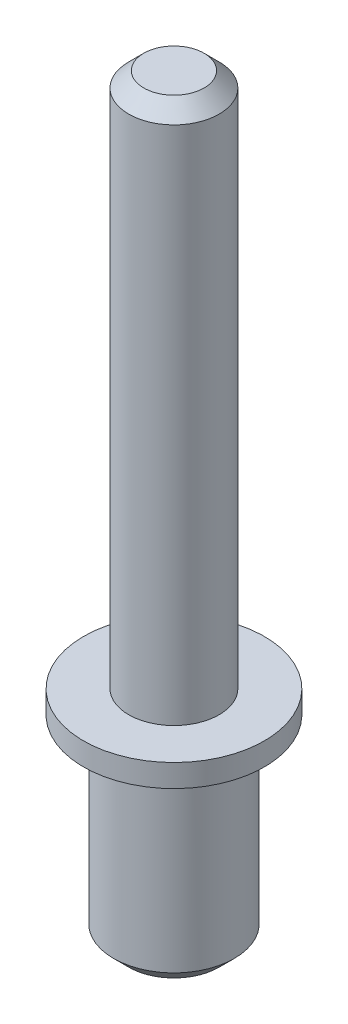
ISO-10303-21;
HEADER;
FILE_DESCRIPTION(('STEP AP214'),'2;1');
FILE_NAME('part.step','',(''),(''),'','','');
FILE_SCHEMA(('AUTOMOTIVE_DESIGN { 1 0 10303 214 1 1 1 1 }'));
ENDSEC;
DATA;
#1=APPLICATION_CONTEXT('core data for automotive mechanical design processes');
#2=APPLICATION_PROTOCOL_DEFINITION('international standard','automotive_design',2000,#1);
#3=PRODUCT_CONTEXT('',#1,'mechanical');
#4=PRODUCT('Part','Part','',(#3));
#5=PRODUCT_RELATED_PRODUCT_CATEGORY('part','',(#4));
#6=PRODUCT_DEFINITION_FORMATION('','',#4);
#7=PRODUCT_DEFINITION_CONTEXT('part definition',#1,'design');
#8=PRODUCT_DEFINITION('design','',#6,#7);
#9=PRODUCT_DEFINITION_SHAPE('','',#8);
#10=(LENGTH_UNIT() NAMED_UNIT(*) SI_UNIT(.MILLI.,.METRE.));
#11=(NAMED_UNIT(*) PLANE_ANGLE_UNIT() SI_UNIT($,.RADIAN.));
#12=(NAMED_UNIT(*) SI_UNIT($,.STERADIAN.) SOLID_ANGLE_UNIT());
#13=UNCERTAINTY_MEASURE_WITH_UNIT(LENGTH_MEASURE(1.E-05),#10,'distance_accuracy_value','');
#14=(GEOMETRIC_REPRESENTATION_CONTEXT(3) GLOBAL_UNCERTAINTY_ASSIGNED_CONTEXT((#13)) GLOBAL_UNIT_ASSIGNED_CONTEXT((#10,
#11,#12)) REPRESENTATION_CONTEXT('',''));
#15=CARTESIAN_POINT('',(0.,0.,0.));
#16=DIRECTION('',(0.,0.,1.));
#17=DIRECTION('',(1.,0.,0.));
#18=AXIS2_PLACEMENT_3D('',#15,#16,#17);
#19=CARTESIAN_POINT('',(0.,0.,0.));
#20=DIRECTION('',(0.,-1.,0.));
#21=DIRECTION('',(1.,0.,0.));
#22=AXIS2_PLACEMENT_3D('',#19,#20,#21);
#23=PLANE('',#22);
#24=CARTESIAN_POINT('',(0.,0.,0.));
#25=DIRECTION('',(0.,-1.,0.));
#26=DIRECTION('',(1.,0.,0.));
#27=AXIS2_PLACEMENT_3D('',#24,#25,#26);
#28=CIRCLE('',#27,2.99999999999998);
#29=CARTESIAN_POINT('',(2.99999999999998,0.,0.));
#30=VERTEX_POINT('',#29);
#31=EDGE_CURVE('E45',#30,#30,#28,.T.);
#32=ORIENTED_EDGE('',*,*,#31,.T.);
#33=EDGE_LOOP('',(#32));
#34=FACE_BOUND('',#33,.T.);
#35=ADVANCED_FACE('F34',(#34),#23,.T.);
#36=CARTESIAN_POINT('',(0.,50.,0.));
#37=DIRECTION('',(0.,1.,0.));
#38=DIRECTION('',(-1.,0.,0.));
#39=AXIS2_PLACEMENT_3D('',#36,#37,#38);
#40=CYLINDRICAL_SURFACE('',#39,3.99999999999999);
#41=CARTESIAN_POINT('',(0.,1.00000000000001,0.));
#42=DIRECTION('',(0.,-1.,0.));
#43=DIRECTION('',(1.,0.,0.));
#44=AXIS2_PLACEMENT_3D('',#41,#42,#43);
#45=CIRCLE('',#44,3.99999999999999);
#46=CARTESIAN_POINT('',(3.99999999999999,1.00000000000001,0.));
#47=VERTEX_POINT('',#46);
#48=EDGE_CURVE('E49',#47,#47,#45,.F.);
#49=ORIENTED_EDGE('',*,*,#48,.T.);
#50=EDGE_LOOP('',(#49));
#51=FACE_BOUND('',#50,.T.);
#52=CARTESIAN_POINT('',(0.,13.,0.));
#53=DIRECTION('',(0.,1.,0.));
#54=DIRECTION('',(-1.,0.,0.));
#55=AXIS2_PLACEMENT_3D('',#52,#53,#54);
#56=CIRCLE('',#55,3.99999999999999);
#57=CARTESIAN_POINT('',(-3.99999999999999,13.,0.));
#58=VERTEX_POINT('',#57);
#59=EDGE_CURVE('E54',#58,#58,#56,.T.);
#60=ORIENTED_EDGE('',*,*,#59,.F.);
#61=EDGE_LOOP('',(#60));
#62=FACE_BOUND('',#61,.T.);
#63=ADVANCED_FACE('F84',(#51,#62),#40,.T.);
#64=CARTESIAN_POINT('',(-3.99999999999999,13.,0.));
#65=DIRECTION('',(0.,-1.,0.));
#66=DIRECTION('',(1.,0.,0.));
#67=AXIS2_PLACEMENT_3D('',#64,#65,#66);
#68=PLANE('',#67);
#69=ORIENTED_EDGE('',*,*,#59,.T.);
#70=EDGE_LOOP('',(#69));
#71=FACE_BOUND('',#70,.T.);
#72=CARTESIAN_POINT('',(0.,13.,0.));
#73=DIRECTION('',(0.,1.,0.));
#74=DIRECTION('',(-1.,0.,0.));
#75=AXIS2_PLACEMENT_3D('',#72,#73,#74);
#76=CIRCLE('',#75,5.99999999999999);
#77=CARTESIAN_POINT('',(-5.99999999999999,13.,0.));
#78=VERTEX_POINT('',#77);
#79=EDGE_CURVE('E57',#78,#78,#76,.T.);
#80=ORIENTED_EDGE('',*,*,#79,.F.);
#81=EDGE_LOOP('',(#80));
#82=FACE_BOUND('',#81,.T.);
#83=ADVANCED_FACE('F80',(#71,#82),#68,.T.);
#84=CARTESIAN_POINT('',(0.,50.,0.));
#85=DIRECTION('',(0.,1.,0.));
#86=DIRECTION('',(-1.,0.,0.));
#87=AXIS2_PLACEMENT_3D('',#84,#85,#86);
#88=CYLINDRICAL_SURFACE('',#87,5.99999999999999);
#89=ORIENTED_EDGE('',*,*,#79,.T.);
#90=EDGE_LOOP('',(#89));
#91=FACE_BOUND('',#90,.T.);
#92=CARTESIAN_POINT('',(0.,14.5,0.));
#93=DIRECTION('',(0.,1.,0.));
#94=DIRECTION('',(-1.,0.,0.));
#95=AXIS2_PLACEMENT_3D('',#92,#93,#94);
#96=CIRCLE('',#95,5.99999999999999);
#97=CARTESIAN_POINT('',(-5.99999999999999,14.5,0.));
#98=VERTEX_POINT('',#97);
#99=EDGE_CURVE('E60',#98,#98,#96,.T.);
#100=ORIENTED_EDGE('',*,*,#99,.F.);
#101=EDGE_LOOP('',(#100));
#102=FACE_BOUND('',#101,.T.);
#103=ADVANCED_FACE('F71',(#91,#102),#88,.T.);
#104=CARTESIAN_POINT('',(-5.99999999999999,14.5,0.));
#105=DIRECTION('',(0.,1.,0.));
#106=DIRECTION('',(-1.,0.,0.));
#107=AXIS2_PLACEMENT_3D('',#104,#105,#106);
#108=PLANE('',#107);
#109=ORIENTED_EDGE('',*,*,#99,.T.);
#110=EDGE_LOOP('',(#109));
#111=FACE_BOUND('',#110,.T.);
#112=CARTESIAN_POINT('',(0.,14.5,0.));
#113=DIRECTION('',(0.,1.,0.));
#114=DIRECTION('',(-1.,0.,0.));
#115=AXIS2_PLACEMENT_3D('',#112,#113,#114);
#116=CIRCLE('',#115,3.);
#117=CARTESIAN_POINT('',(-3.,14.5,0.));
#118=VERTEX_POINT('',#117);
#119=EDGE_CURVE('E63',#118,#118,#116,.T.);
#120=ORIENTED_EDGE('',*,*,#119,.F.);
#121=EDGE_LOOP('',(#120));
#122=FACE_BOUND('',#121,.T.);
#123=ADVANCED_FACE('F69',(#111,#122),#108,.T.);
#124=CARTESIAN_POINT('',(0.,50.,0.));
#125=DIRECTION('',(0.,1.,0.));
#126=DIRECTION('',(-1.,0.,0.));
#127=AXIS2_PLACEMENT_3D('',#124,#125,#126);
#128=CYLINDRICAL_SURFACE('',#127,3.);
#129=CARTESIAN_POINT('',(0.,49.,0.));
#130=DIRECTION('',(0.,1.,0.));
#131=DIRECTION('',(-1.,0.,0.));
#132=AXIS2_PLACEMENT_3D('',#129,#130,#131);
#133=CIRCLE('',#132,3.);
#134=CARTESIAN_POINT('',(-3.,49.,0.));
#135=VERTEX_POINT('',#134);
#136=EDGE_CURVE('E10',#135,#135,#133,.F.);
#137=ORIENTED_EDGE('',*,*,#136,.T.);
#138=EDGE_LOOP('',(#137));
#139=FACE_BOUND('',#138,.T.);
#140=ORIENTED_EDGE('',*,*,#119,.T.);
#141=EDGE_LOOP('',(#140));
#142=FACE_BOUND('',#141,.T.);
#143=ADVANCED_FACE('F67',(#139,#142),#128,.T.);
#144=CARTESIAN_POINT('',(-3.,50.,0.));
#145=DIRECTION('',(0.,1.,0.));
#146=DIRECTION('',(-1.,0.,0.));
#147=AXIS2_PLACEMENT_3D('',#144,#145,#146);
#148=PLANE('',#147);
#149=CARTESIAN_POINT('',(0.,50.,0.));
#150=DIRECTION('',(0.,1.,0.));
#151=DIRECTION('',(-1.,0.,0.));
#152=AXIS2_PLACEMENT_3D('',#149,#150,#151);
#153=CIRCLE('',#152,1.99999999999999);
#154=CARTESIAN_POINT('',(-2.,50.,0.));
#155=VERTEX_POINT('',#154);
#156=EDGE_CURVE('E41',#155,#155,#153,.T.);
#157=ORIENTED_EDGE('',*,*,#156,.T.);
#158=EDGE_LOOP('',(#157));
#159=FACE_BOUND('',#158,.T.);
#160=ADVANCED_FACE('F78',(#159),#148,.T.);
#161=CARTESIAN_POINT('',(0.,1.00000000000001,0.));
#162=DIRECTION('',(0.,1.,0.));
#163=DIRECTION('',(-1.,0.,0.));
#164=AXIS2_PLACEMENT_3D('',#161,#162,#163);
#165=CONICAL_SURFACE('',#164,3.99999999999999,0.78539816339745);
#166=ORIENTED_EDGE('',*,*,#31,.F.);
#167=EDGE_LOOP('',(#166));
#168=FACE_BOUND('',#167,.T.);
#169=ORIENTED_EDGE('',*,*,#48,.F.);
#170=EDGE_LOOP('',(#169));
#171=FACE_BOUND('',#170,.T.);
#172=ADVANCED_FACE('F93',(#168,#171),#165,.T.);
#173=CARTESIAN_POINT('',(0.,50.,0.));
#174=DIRECTION('',(0.,-1.,0.));
#175=DIRECTION('',(1.,0.,0.));
#176=AXIS2_PLACEMENT_3D('',#173,#174,#175);
#177=CONICAL_SURFACE('',#176,1.99999999999999,0.785398163397447);
#178=ORIENTED_EDGE('',*,*,#136,.F.);
#179=EDGE_LOOP('',(#178));
#180=FACE_BOUND('',#179,.T.);
#181=ORIENTED_EDGE('',*,*,#156,.F.);
#182=EDGE_LOOP('',(#181));
#183=FACE_BOUND('',#182,.T.);
#184=ADVANCED_FACE('F36',(#180,#183),#177,.T.);
#185=CLOSED_SHELL('',(#35,#63,#83,#103,#123,#143,#160,#172,#184));
#186=MANIFOLD_SOLID_BREP('B2',#185);
#187=ADVANCED_BREP_SHAPE_REPRESENTATION('',(#18,#186),#14);
#188=SHAPE_DEFINITION_REPRESENTATION(#9,#187);
ENDSEC;
END-ISO-10303-21;
